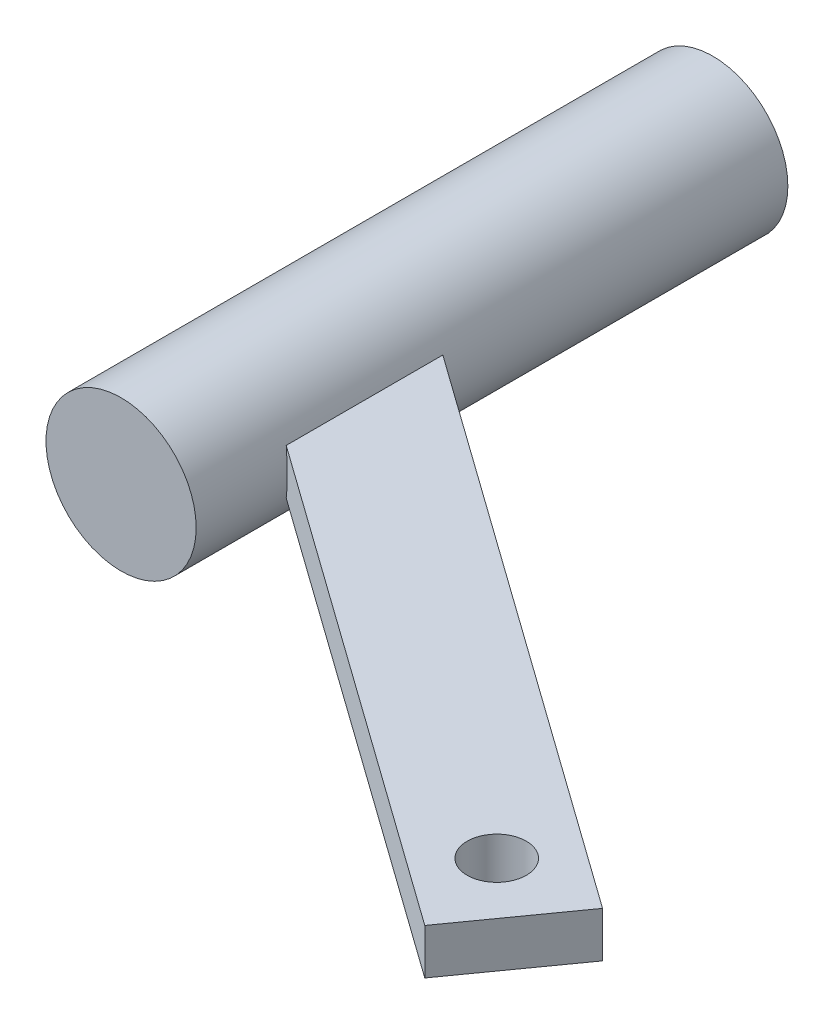
ISO-10303-21;
HEADER;
FILE_DESCRIPTION(('STEP AP214'),'2;1');
FILE_NAME('part.step','',(''),(''),'','','');
FILE_SCHEMA(('AUTOMOTIVE_DESIGN { 1 0 10303 214 1 1 1 1 }'));
ENDSEC;
DATA;
#1=APPLICATION_CONTEXT('core data for automotive mechanical design processes');
#2=APPLICATION_PROTOCOL_DEFINITION('international standard','automotive_design',2000,#1);
#3=PRODUCT_CONTEXT('',#1,'mechanical');
#4=PRODUCT('Part','Part','',(#3));
#5=PRODUCT_RELATED_PRODUCT_CATEGORY('part','',(#4));
#6=PRODUCT_DEFINITION_FORMATION('','',#4);
#7=PRODUCT_DEFINITION_CONTEXT('part definition',#1,'design');
#8=PRODUCT_DEFINITION('design','',#6,#7);
#9=PRODUCT_DEFINITION_SHAPE('','',#8);
#10=(LENGTH_UNIT() NAMED_UNIT(*) SI_UNIT(.MILLI.,.METRE.));
#11=(NAMED_UNIT(*) PLANE_ANGLE_UNIT() SI_UNIT($,.RADIAN.));
#12=(NAMED_UNIT(*) SI_UNIT($,.STERADIAN.) SOLID_ANGLE_UNIT());
#13=UNCERTAINTY_MEASURE_WITH_UNIT(LENGTH_MEASURE(1.E-05),#10,'distance_accuracy_value','');
#14=(GEOMETRIC_REPRESENTATION_CONTEXT(3) GLOBAL_UNCERTAINTY_ASSIGNED_CONTEXT((#13)) GLOBAL_UNIT_ASSIGNED_CONTEXT((#10,
#11,#12)) REPRESENTATION_CONTEXT('',''));
#15=CARTESIAN_POINT('',(0.,0.,0.));
#16=DIRECTION('',(0.,0.,1.));
#17=DIRECTION('',(1.,0.,0.));
#18=AXIS2_PLACEMENT_3D('',#15,#16,#17);
#19=CARTESIAN_POINT('',(0.,0.,130.));
#20=DIRECTION('',(0.,0.,-1.));
#21=DIRECTION('',(-1.,0.,0.));
#22=AXIS2_PLACEMENT_3D('',#19,#20,#21);
#23=CYLINDRICAL_SURFACE('',#22,16.5);
#24=CARTESIAN_POINT('',(0.,0.,0.));
#25=DIRECTION('',(0.,0.,1.));
#26=DIRECTION('',(1.,0.,0.));
#27=AXIS2_PLACEMENT_3D('',#24,#25,#26);
#28=CIRCLE('',#27,16.5);
#29=CARTESIAN_POINT('',(16.5,0.,0.));
#30=VERTEX_POINT('',#29);
#31=EDGE_CURVE('E101',#30,#30,#28,.T.);
#32=ORIENTED_EDGE('',*,*,#31,.T.);
#33=EDGE_LOOP('',(#32));
#34=FACE_BOUND('',#33,.T.);
#35=CARTESIAN_POINT('',(0.,0.,130.));
#36=DIRECTION('',(0.,0.,1.));
#37=DIRECTION('',(1.,0.,0.));
#38=AXIS2_PLACEMENT_3D('',#35,#36,#37);
#39=CIRCLE('',#38,16.5);
#40=CARTESIAN_POINT('',(16.5,0.,130.));
#41=VERTEX_POINT('',#40);
#42=EDGE_CURVE('E103',#41,#41,#39,.T.);
#43=ORIENTED_EDGE('',*,*,#42,.F.);
#44=EDGE_LOOP('',(#43));
#45=FACE_BOUND('',#44,.T.);
#46=DIRECTION('',(0.,0.,-1.));
#47=VECTOR('',#46,1.);
#48=CARTESIAN_POINT('',(15.7241851935164,-5.,130.));
#49=LINE('',#48,#47);
#50=CARTESIAN_POINT('',(15.7241851935164,-5.,109.445846566797));
#51=VERTEX_POINT('',#50);
#52=CARTESIAN_POINT('',(15.7241851935164,-5.,75.036545498627));
#53=VERTEX_POINT('',#52);
#54=EDGE_CURVE('E11',#51,#53,#49,.T.);
#55=ORIENTED_EDGE('',*,*,#54,.F.);
#56=CARTESIAN_POINT('',(0.,0.,98.2142857142857));
#57=DIRECTION('',(-0.581238193719097,0.,0.813733471206734));
#58=DIRECTION('',(-0.813733471206734,0.,-0.581238193719097));
#59=AXIS2_PLACEMENT_3D('',#56,#57,#58);
#60=ELLIPSE('',#59,20.2769095580291,16.5);
#61=CARTESIAN_POINT('',(15.7241851935164,5.,109.445846566797));
#62=VERTEX_POINT('',#61);
#63=EDGE_CURVE('E56',#51,#62,#60,.T.);
#64=ORIENTED_EDGE('',*,*,#63,.T.);
#65=DIRECTION('',(0.,0.,-1.));
#66=VECTOR('',#65,1.);
#67=CARTESIAN_POINT('',(15.7241851935164,5.,130.));
#68=LINE('',#67,#66);
#69=CARTESIAN_POINT('',(15.7241851935164,5.,75.036545498627));
#70=VERTEX_POINT('',#69);
#71=EDGE_CURVE('E78',#62,#70,#68,.T.);
#72=ORIENTED_EDGE('',*,*,#71,.T.);
#73=CARTESIAN_POINT('',(0.,0.,63.8049846461153));
#74=DIRECTION('',(0.581238193719097,0.,-0.813733471206735));
#75=DIRECTION('',(-0.813733471206735,0.,-0.581238193719097));
#76=AXIS2_PLACEMENT_3D('',#73,#74,#75);
#77=ELLIPSE('',#76,20.2769095580291,16.5);
#78=EDGE_CURVE('E41',#70,#53,#77,.T.);
#79=ORIENTED_EDGE('',*,*,#78,.T.);
#80=EDGE_LOOP('',(#55,#64,#72,#79));
#81=FACE_BOUND('',#80,.T.);
#82=ADVANCED_FACE('F34',(#34,#45,#81),#23,.T.);
#83=CARTESIAN_POINT('',(0.,0.,130.));
#84=DIRECTION('',(0.,0.,1.));
#85=DIRECTION('',(1.,0.,0.));
#86=AXIS2_PLACEMENT_3D('',#83,#84,#85);
#87=PLANE('',#86);
#88=ORIENTED_EDGE('',*,*,#42,.T.);
#89=EDGE_LOOP('',(#88));
#90=FACE_BOUND('',#89,.T.);
#91=ADVANCED_FACE('F127',(#90),#87,.T.);
#92=CARTESIAN_POINT('',(0.,0.,0.));
#93=DIRECTION('',(0.,0.,1.));
#94=DIRECTION('',(1.,0.,0.));
#95=AXIS2_PLACEMENT_3D('',#92,#93,#94);
#96=PLANE('',#95);
#97=ORIENTED_EDGE('',*,*,#31,.F.);
#98=EDGE_LOOP('',(#97));
#99=FACE_BOUND('',#98,.T.);
#100=ADVANCED_FACE('F118',(#99),#96,.F.);
#101=CARTESIAN_POINT('',(0.,-5.,0.));
#102=DIRECTION('',(0.,1.,0.));
#103=DIRECTION('',(0.,0.,1.));
#104=AXIS2_PLACEMENT_3D('',#101,#102,#103);
#105=PLANE('',#104);
#106=CARTESIAN_POINT('',(117.402950429635,-5.,164.868885487083));
#107=DIRECTION('',(0.,1.,0.));
#108=DIRECTION('',(0.,0.,1.));
#109=AXIS2_PLACEMENT_3D('',#106,#107,#108);
#110=CIRCLE('',#109,6.5);
#111=CARTESIAN_POINT('',(117.402950429635,-5.,171.368885487083));
#112=VERTEX_POINT('',#111);
#113=EDGE_CURVE('E79',#112,#112,#110,.T.);
#114=ORIENTED_EDGE('',*,*,#113,.T.);
#115=EDGE_LOOP('',(#114));
#116=FACE_BOUND('',#115,.T.);
#117=DIRECTION('',(0.813733471206734,0.,0.581238193719097));
#118=VECTOR('',#117,1.);
#119=CARTESIAN_POINT('',(0.,-5.,98.2142857142857));
#120=LINE('',#119,#118);
#121=CARTESIAN_POINT('',(122.285351256875,-5.,185.560965183483));
#122=VERTEX_POINT('',#121);
#123=EDGE_CURVE('E84',#51,#122,#120,.T.);
#124=ORIENTED_EDGE('',*,*,#123,.F.);
#125=ORIENTED_EDGE('',*,*,#54,.T.);
#126=DIRECTION('',(-0.813733471206735,0.,-0.581238193719097));
#127=VECTOR('',#126,1.);
#128=CARTESIAN_POINT('',(138.56002068101,-5.,162.776427989694));
#129=LINE('',#128,#127);
#130=CARTESIAN_POINT('',(138.56002068101,-5.,162.776427989694));
#131=VERTEX_POINT('',#130);
#132=EDGE_CURVE('E89',#131,#53,#129,.T.);
#133=ORIENTED_EDGE('',*,*,#132,.F.);
#134=DIRECTION('',(0.581238193719098,0.,-0.813733471206734));
#135=VECTOR('',#134,1.);
#136=CARTESIAN_POINT('',(122.285351256875,-5.,185.560965183483));
#137=LINE('',#136,#135);
#138=EDGE_CURVE('E97',#122,#131,#137,.T.);
#139=ORIENTED_EDGE('',*,*,#138,.F.);
#140=EDGE_LOOP('',(#124,#125,#133,#139));
#141=FACE_BOUND('',#140,.T.);
#142=ADVANCED_FACE('F116',(#116,#141),#105,.F.);
#143=CARTESIAN_POINT('',(0.,5.,0.));
#144=DIRECTION('',(0.,1.,0.));
#145=DIRECTION('',(0.,0.,1.));
#146=AXIS2_PLACEMENT_3D('',#143,#144,#145);
#147=PLANE('',#146);
#148=CARTESIAN_POINT('',(117.402950429635,5.,164.868885487083));
#149=DIRECTION('',(0.,1.,0.));
#150=DIRECTION('',(0.,0.,1.));
#151=AXIS2_PLACEMENT_3D('',#148,#149,#150);
#152=CIRCLE('',#151,6.5);
#153=CARTESIAN_POINT('',(117.402950429635,5.,171.368885487083));
#154=VERTEX_POINT('',#153);
#155=EDGE_CURVE('E203',#154,#154,#152,.T.);
#156=ORIENTED_EDGE('',*,*,#155,.F.);
#157=EDGE_LOOP('',(#156));
#158=FACE_BOUND('',#157,.T.);
#159=ORIENTED_EDGE('',*,*,#71,.F.);
#160=DIRECTION('',(0.813733471206734,0.,0.581238193719097));
#161=VECTOR('',#160,1.);
#162=CARTESIAN_POINT('',(0.,5.,98.2142857142857));
#163=LINE('',#162,#161);
#164=CARTESIAN_POINT('',(122.285351256875,5.,185.560965183483));
#165=VERTEX_POINT('',#164);
#166=EDGE_CURVE('E72',#62,#165,#163,.T.);
#167=ORIENTED_EDGE('',*,*,#166,.T.);
#168=DIRECTION('',(0.581238193719098,0.,-0.813733471206734));
#169=VECTOR('',#168,1.);
#170=CARTESIAN_POINT('',(122.285351256875,5.,185.560965183483));
#171=LINE('',#170,#169);
#172=CARTESIAN_POINT('',(138.56002068101,5.,162.776427989694));
#173=VERTEX_POINT('',#172);
#174=EDGE_CURVE('E76',#165,#173,#171,.T.);
#175=ORIENTED_EDGE('',*,*,#174,.T.);
#176=DIRECTION('',(-0.813733471206735,0.,-0.581238193719097));
#177=VECTOR('',#176,1.);
#178=CARTESIAN_POINT('',(138.56002068101,5.,162.776427989694));
#179=LINE('',#178,#177);
#180=EDGE_CURVE('E48',#173,#70,#179,.T.);
#181=ORIENTED_EDGE('',*,*,#180,.T.);
#182=EDGE_LOOP('',(#159,#167,#175,#181));
#183=FACE_BOUND('',#182,.T.);
#184=ADVANCED_FACE('F74',(#158,#183),#147,.T.);
#185=CARTESIAN_POINT('',(138.56002068101,-5.,162.776427989694));
#186=DIRECTION('',(0.581238193719097,0.,-0.813733471206735));
#187=DIRECTION('',(-0.813733471206735,0.,-0.581238193719097));
#188=AXIS2_PLACEMENT_3D('',#185,#186,#187);
#189=PLANE('',#188);
#190=ORIENTED_EDGE('',*,*,#78,.F.);
#191=ORIENTED_EDGE('',*,*,#180,.F.);
#192=DIRECTION('',(0.,1.,0.));
#193=VECTOR('',#192,1.);
#194=CARTESIAN_POINT('',(138.56002068101,-5.,162.776427989694));
#195=LINE('',#194,#193);
#196=EDGE_CURVE('E88',#131,#173,#195,.T.);
#197=ORIENTED_EDGE('',*,*,#196,.F.);
#198=ORIENTED_EDGE('',*,*,#132,.T.);
#199=EDGE_LOOP('',(#190,#191,#197,#198));
#200=FACE_BOUND('',#199,.T.);
#201=ADVANCED_FACE('F113',(#200),#189,.T.);
#202=CARTESIAN_POINT('',(122.285351256875,-5.,185.560965183483));
#203=DIRECTION('',(0.813733471206734,0.,0.581238193719098));
#204=DIRECTION('',(0.581238193719098,0.,-0.813733471206734));
#205=AXIS2_PLACEMENT_3D('',#202,#203,#204);
#206=PLANE('',#205);
#207=ORIENTED_EDGE('',*,*,#196,.T.);
#208=ORIENTED_EDGE('',*,*,#174,.F.);
#209=DIRECTION('',(0.,1.,0.));
#210=VECTOR('',#209,1.);
#211=CARTESIAN_POINT('',(122.285351256875,-5.,185.560965183483));
#212=LINE('',#211,#210);
#213=EDGE_CURVE('E82',#122,#165,#212,.T.);
#214=ORIENTED_EDGE('',*,*,#213,.F.);
#215=ORIENTED_EDGE('',*,*,#138,.T.);
#216=EDGE_LOOP('',(#207,#208,#214,#215));
#217=FACE_BOUND('',#216,.T.);
#218=ADVANCED_FACE('F91',(#217),#206,.T.);
#219=CARTESIAN_POINT('',(0.,-5.,98.2142857142857));
#220=DIRECTION('',(-0.581238193719097,0.,0.813733471206734));
#221=DIRECTION('',(0.813733471206734,0.,0.581238193719097));
#222=AXIS2_PLACEMENT_3D('',#219,#220,#221);
#223=PLANE('',#222);
#224=ORIENTED_EDGE('',*,*,#63,.F.);
#225=ORIENTED_EDGE('',*,*,#123,.T.);
#226=ORIENTED_EDGE('',*,*,#213,.T.);
#227=ORIENTED_EDGE('',*,*,#166,.F.);
#228=EDGE_LOOP('',(#224,#225,#226,#227));
#229=FACE_BOUND('',#228,.T.);
#230=ADVANCED_FACE('F83',(#229),#223,.T.);
#231=CARTESIAN_POINT('',(117.402950429635,-15.,164.868885487083));
#232=DIRECTION('',(0.,1.,0.));
#233=DIRECTION('',(0.,0.,1.));
#234=AXIS2_PLACEMENT_3D('',#231,#232,#233);
#235=CYLINDRICAL_SURFACE('',#234,6.5);
#236=ORIENTED_EDGE('',*,*,#155,.T.);
#237=EDGE_LOOP('',(#236));
#238=FACE_BOUND('',#237,.T.);
#239=ORIENTED_EDGE('',*,*,#113,.F.);
#240=EDGE_LOOP('',(#239));
#241=FACE_BOUND('',#240,.T.);
#242=ADVANCED_FACE('F146',(#238,#241),#235,.F.);
#243=CLOSED_SHELL('',(#82,#91,#100,#142,#184,#201,#218,#230,#242));
#244=MANIFOLD_SOLID_BREP('B2',#243);
#245=ADVANCED_BREP_SHAPE_REPRESENTATION('',(#18,#244),#14);
#246=SHAPE_DEFINITION_REPRESENTATION(#9,#245);
ENDSEC;
END-ISO-10303-21;
